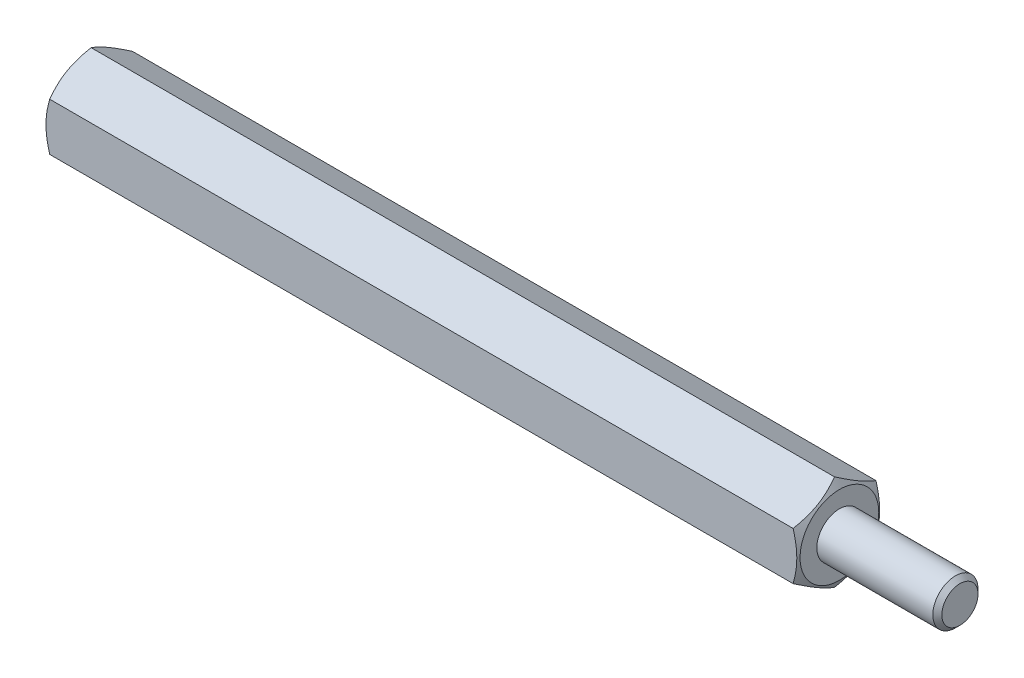
ISO-10303-21;
HEADER;
FILE_DESCRIPTION(('STEP AP214'),'2;1');
FILE_NAME('part.step','',(''),(''),'','','');
FILE_SCHEMA(('AUTOMOTIVE_DESIGN { 1 0 10303 214 1 1 1 1 }'));
ENDSEC;
DATA;
#1=APPLICATION_CONTEXT('core data for automotive mechanical design processes');
#2=APPLICATION_PROTOCOL_DEFINITION('international standard','automotive_design',2000,#1);
#3=PRODUCT_CONTEXT('',#1,'mechanical');
#4=PRODUCT('Part','Part','',(#3));
#5=PRODUCT_RELATED_PRODUCT_CATEGORY('part','',(#4));
#6=PRODUCT_DEFINITION_FORMATION('','',#4);
#7=PRODUCT_DEFINITION_CONTEXT('part definition',#1,'design');
#8=PRODUCT_DEFINITION('design','',#6,#7);
#9=PRODUCT_DEFINITION_SHAPE('','',#8);
#10=(LENGTH_UNIT() NAMED_UNIT(*) SI_UNIT(.MILLI.,.METRE.));
#11=(NAMED_UNIT(*) PLANE_ANGLE_UNIT() SI_UNIT($,.RADIAN.));
#12=(NAMED_UNIT(*) SI_UNIT($,.STERADIAN.) SOLID_ANGLE_UNIT());
#13=UNCERTAINTY_MEASURE_WITH_UNIT(LENGTH_MEASURE(1.E-05),#10,'distance_accuracy_value','');
#14=(GEOMETRIC_REPRESENTATION_CONTEXT(3) GLOBAL_UNCERTAINTY_ASSIGNED_CONTEXT((#13)) GLOBAL_UNIT_ASSIGNED_CONTEXT((#10,
#11,#12)) REPRESENTATION_CONTEXT('',''));
#15=CARTESIAN_POINT('',(0.,0.,0.));
#16=DIRECTION('',(0.,0.,1.));
#17=DIRECTION('',(1.,0.,0.));
#18=AXIS2_PLACEMENT_3D('',#15,#16,#17);
#19=CARTESIAN_POINT('',(50.,0.,0.));
#20=DIRECTION('',(1.,0.,0.));
#21=DIRECTION('',(0.,0.,-1.));
#22=AXIS2_PLACEMENT_3D('',#19,#20,#21);
#23=PLANE('',#22);
#24=CARTESIAN_POINT('',(50.,0.,0.));
#25=DIRECTION('',(1.,0.,0.));
#26=DIRECTION('',(0.,0.,-1.));
#27=AXIS2_PLACEMENT_3D('',#24,#25,#26);
#28=CIRCLE('',#27,1.5);
#29=CARTESIAN_POINT('',(50.,0.,-1.5));
#30=VERTEX_POINT('',#29);
#31=EDGE_CURVE('E122',#30,#30,#28,.T.);
#32=ORIENTED_EDGE('',*,*,#31,.F.);
#33=EDGE_LOOP('',(#32));
#34=FACE_BOUND('',#33,.T.);
#35=CARTESIAN_POINT('',(50.,0.,0.));
#36=DIRECTION('',(1.,0.,0.));
#37=DIRECTION('',(0.,0.,-1.));
#38=AXIS2_PLACEMENT_3D('',#35,#36,#37);
#39=CIRCLE('',#38,2.61250000000001);
#40=CARTESIAN_POINT('',(50.,0.,-2.61250000000001));
#41=VERTEX_POINT('',#40);
#42=EDGE_CURVE('E254',#41,#41,#39,.T.);
#43=ORIENTED_EDGE('',*,*,#42,.T.);
#44=EDGE_LOOP('',(#43));
#45=FACE_BOUND('',#44,.T.);
#46=ADVANCED_FACE('F35',(#34,#45),#23,.T.);
#47=CARTESIAN_POINT('',(58.,0.,0.));
#48=DIRECTION('',(-1.,0.,0.));
#49=DIRECTION('',(0.,0.,1.));
#50=AXIS2_PLACEMENT_3D('',#47,#48,#49);
#51=CYLINDRICAL_SURFACE('',#50,1.5);
#52=CARTESIAN_POINT('',(57.7,0.,0.));
#53=DIRECTION('',(1.,0.,0.));
#54=DIRECTION('',(0.,0.,-1.));
#55=AXIS2_PLACEMENT_3D('',#52,#53,#54);
#56=CIRCLE('',#55,1.5);
#57=CARTESIAN_POINT('',(57.7,0.,-1.5));
#58=VERTEX_POINT('',#57);
#59=EDGE_CURVE('E11',#58,#58,#56,.F.);
#60=ORIENTED_EDGE('',*,*,#59,.T.);
#61=EDGE_LOOP('',(#60));
#62=FACE_BOUND('',#61,.T.);
#63=ORIENTED_EDGE('',*,*,#31,.T.);
#64=EDGE_LOOP('',(#63));
#65=FACE_BOUND('',#64,.T.);
#66=ADVANCED_FACE('F231',(#62,#65),#51,.T.);
#67=CARTESIAN_POINT('',(58.,0.,0.));
#68=DIRECTION('',(1.,0.,0.));
#69=DIRECTION('',(0.,0.,-1.));
#70=AXIS2_PLACEMENT_3D('',#67,#68,#69);
#71=PLANE('',#70);
#72=CARTESIAN_POINT('',(58.,0.,0.));
#73=DIRECTION('',(1.,0.,0.));
#74=DIRECTION('',(0.,0.,-1.));
#75=AXIS2_PLACEMENT_3D('',#72,#73,#74);
#76=CIRCLE('',#75,1.20000000000001);
#77=CARTESIAN_POINT('',(58.,0.,-1.20000000000001));
#78=VERTEX_POINT('',#77);
#79=EDGE_CURVE('E43',#78,#78,#76,.T.);
#80=ORIENTED_EDGE('',*,*,#79,.T.);
#81=EDGE_LOOP('',(#80));
#82=FACE_BOUND('',#81,.T.);
#83=ADVANCED_FACE('F154',(#82),#71,.T.);
#84=CARTESIAN_POINT('',(50.,0.,0.));
#85=DIRECTION('',(-1.,0.,0.));
#86=DIRECTION('',(0.,0.,1.));
#87=AXIS2_PLACEMENT_3D('',#84,#85,#86);
#88=CONICAL_SURFACE('',#87,2.61250000000001,1.0471975511966);
#89=ORIENTED_EDGE('',*,*,#42,.F.);
#90=EDGE_LOOP('',(#89));
#91=FACE_BOUND('',#90,.T.);
#92=CARTESIAN_POINT('',(49.6749275746217,1.58759777021764,-2.7502));
#93=CARTESIAN_POINT('',(49.7152266757372,1.65737010029699,-2.62935077934009));
#94=CARTESIAN_POINT('',(49.7518774353888,1.72774469983534,-2.50745839737736));
#95=CARTESIAN_POINT('',(49.8158521550166,1.86971254687003,-2.2615628732721));
#96=CARTESIAN_POINT('',(49.8431534823119,1.94130831721583,-2.13755536142614));
#97=CARTESIAN_POINT('',(49.8856525926923,2.08361254889599,-1.89107720202405));
#98=CARTESIAN_POINT('',(49.901133219364,2.15429911309864,-1.76864448141258));
#99=CARTESIAN_POINT('',(49.9196149406165,2.29600490065923,-1.52320285763108));
#100=CARTESIAN_POINT('',(49.9226313385238,2.36702360884404,-1.40019484676708));
#101=CARTESIAN_POINT('',(49.9163611925579,2.49972966594897,-1.1703412133892));
#102=CARTESIAN_POINT('',(49.9086141837097,2.56143686540073,-1.06346120874597));
#103=CARTESIAN_POINT('',(49.8840591569221,2.68444923614047,-0.850397532665245));
#104=CARTESIAN_POINT('',(49.8672427483359,2.74575398185008,-0.744214598351105));
#105=CARTESIAN_POINT('',(49.8252024156405,2.86902004703207,-0.530711510606811));
#106=CARTESIAN_POINT('',(49.7998002572992,2.93096576264319,-0.42341838385714));
#107=CARTESIAN_POINT('',(49.7421471121465,3.05393320806134,-0.210432520715945));
#108=CARTESIAN_POINT('',(49.7099096746875,3.11495651365995,-0.104737054973344));
#109=CARTESIAN_POINT('',(49.6749275746217,3.17554195059678,0.000200000000003022));
#110=B_SPLINE_CURVE_WITH_KNOTS('',3,(#92,#93,#94,#95,#96,#97,#98,#99,#100,#101,#102,#103,#104,
#105,#106,#107,#108,#109),.UNSPECIFIED.,.F.,.F.,(4,2,2,2,2,2,2,2,4),(0.,0.435912828725887,
0.872873557116332,1.29901931904671,1.72464171213574,2.09526089052938,2.46622354066374,
2.84541551798557,3.22386274754524),.UNSPECIFIED.);
#111=CARTESIAN_POINT('',(49.6749942449246,1.58771324027148,-2.75));
#112=VERTEX_POINT('',#111);
#113=CARTESIAN_POINT('',(49.6749942449246,3.17542648054294,0.));
#114=VERTEX_POINT('',#113);
#115=EDGE_CURVE('E133',#112,#114,#110,.T.);
#116=ORIENTED_EDGE('',*,*,#115,.T.);
#117=CARTESIAN_POINT('',(49.6749275746217,3.17554195059678,-0.000199999999995645));
#118=CARTESIAN_POINT('',(49.7152266757372,3.10576962051743,0.12064922065991));
#119=CARTESIAN_POINT('',(49.7518774353888,3.03539502097908,0.242541602622638));
#120=CARTESIAN_POINT('',(49.8158521550166,2.89342717394439,0.488437126727897));
#121=CARTESIAN_POINT('',(49.8431534823119,2.82183140359858,0.612444638573861));
#122=CARTESIAN_POINT('',(49.8856525926923,2.67952717191843,0.858922797975949));
#123=CARTESIAN_POINT('',(49.901133219364,2.60884060771577,0.981355518587423));
#124=CARTESIAN_POINT('',(49.9196149406165,2.46713482015519,1.22679714236892));
#125=CARTESIAN_POINT('',(49.9226313385238,2.39611611197038,1.34980515323292));
#126=CARTESIAN_POINT('',(49.9163611925579,2.26341005486544,1.5796587866108));
#127=CARTESIAN_POINT('',(49.9086141837097,2.20170285541369,1.68653879125403));
#128=CARTESIAN_POINT('',(49.8840591569221,2.07869048467395,1.89960246733475));
#129=CARTESIAN_POINT('',(49.8672427483359,2.01738573896434,2.00578540164889));
#130=CARTESIAN_POINT('',(49.8252024156405,1.89411967378235,2.21928848939319));
#131=CARTESIAN_POINT('',(49.7998002572992,1.83217395817123,2.32658161614286));
#132=CARTESIAN_POINT('',(49.7421471121465,1.70920651275308,2.53956747928405));
#133=CARTESIAN_POINT('',(49.7099096746875,1.64818320715446,2.64526294502665));
#134=CARTESIAN_POINT('',(49.6749275746217,1.58759777021764,2.7502));
#135=B_SPLINE_CURVE_WITH_KNOTS('',3,(#117,#118,#119,#120,#121,#122,#123,#124,#125,#126,#127,
#128,#129,#130,#131,#132,#133,#134),.UNSPECIFIED.,.F.,.F.,(4,2,2,2,2,2,2,2,4),(0.,
0.435912828725887,0.872873557116332,1.29901931904672,1.72464171213574,2.09526089052937,
2.46622354066374,2.84541551798557,3.22386274754524),.UNSPECIFIED.);
#136=CARTESIAN_POINT('',(49.6749942449246,1.58771324027147,2.75));
#137=VERTEX_POINT('',#136);
#138=EDGE_CURVE('E141',#114,#137,#135,.T.);
#139=ORIENTED_EDGE('',*,*,#138,.T.);
#140=CARTESIAN_POINT('',(48.5576319326316,-4.30782014241011,2.75));
#141=CARTESIAN_POINT('',(48.6162836095867,-4.18726531654581,2.75));
#142=CARTESIAN_POINT('',(48.6743849240466,-4.06643816910979,2.75));
#143=CARTESIAN_POINT('',(48.7891778669407,-3.8240944166195,2.75));
#144=CARTESIAN_POINT('',(48.8458692806511,-3.70257770996671,2.75));
#145=CARTESIAN_POINT('',(48.9578090560797,-3.458105356063,2.75));
#146=CARTESIAN_POINT('',(49.0130482619427,-3.33514550230564,2.75));
#147=CARTESIAN_POINT('',(49.1213204698911,-3.08826186435015,2.75));
#148=CARTESIAN_POINT('',(49.1743535739049,-2.96433812500113,2.75));
#149=CARTESIAN_POINT('',(49.2792921273943,-2.7113269404381,2.75));
#150=CARTESIAN_POINT('',(49.3311065567683,-2.58220154142924,2.75));
#151=CARTESIAN_POINT('',(49.430916990516,-2.32245648864391,2.75));
#152=CARTESIAN_POINT('',(49.4789125727853,-2.19183667150655,2.75));
#153=CARTESIAN_POINT('',(49.5698579692354,-1.92912498594656,2.75));
#154=CARTESIAN_POINT('',(49.6128175918125,-1.79703654670007,2.75));
#155=CARTESIAN_POINT('',(49.6923417781181,-1.53096629694382,2.75));
#156=CARTESIAN_POINT('',(49.7289083094407,-1.39698508274037,2.75));
#157=CARTESIAN_POINT('',(49.7937438460925,-1.12772708047234,2.75));
#158=CARTESIAN_POINT('',(49.8220547897378,-0.992460577616631,2.75));
#159=CARTESIAN_POINT('',(49.8687813176856,-0.720203153927685,2.75));
#160=CARTESIAN_POINT('',(49.8871980675805,-0.583212438163358,2.75));
#161=CARTESIAN_POINT('',(49.9124291314624,-0.309989978008801,2.75));
#162=CARTESIAN_POINT('',(49.9193954911205,-0.17377262999625,2.75));
#163=CARTESIAN_POINT('',(49.9215379629552,0.0987726794769197,2.75));
#164=CARTESIAN_POINT('',(49.9167134971984,0.235100646032144,2.75));
#165=CARTESIAN_POINT('',(49.8989680753535,0.465158037199999,2.75));
#166=CARTESIAN_POINT('',(49.8889841108657,0.559128814459647,2.75));
#167=CARTESIAN_POINT('',(49.8640111201075,0.746408748148825,2.75));
#168=CARTESIAN_POINT('',(49.8490213815566,0.839717808490765,2.75));
#169=CARTESIAN_POINT('',(49.7973222369876,1.11853931619131,2.75));
#170=CARTESIAN_POINT('',(49.7538938441819,1.30282115121641,2.75));
#171=CARTESIAN_POINT('',(49.6782135831305,1.5786792582721,2.75));
#172=CARTESIAN_POINT('',(49.6508277417716,1.67167174830885,2.75));
#173=CARTESIAN_POINT('',(49.5931453490653,1.85669755112827,2.75));
#174=CARTESIAN_POINT('',(49.562850519184,1.94873139590001,2.75));
#175=CARTESIAN_POINT('',(49.4998214739185,2.13194851920638,2.75));
#176=CARTESIAN_POINT('',(49.4670873446708,2.22313182764733,2.75));
#177=CARTESIAN_POINT('',(49.3995759688816,2.40475072200258,2.75));
#178=CARTESIAN_POINT('',(49.3647984472483,2.49518620536279,2.75));
#179=CARTESIAN_POINT('',(49.286074979109,2.69425906745494,2.75));
#180=CARTESIAN_POINT('',(49.2417347386106,2.8027401541903,2.75));
#181=CARTESIAN_POINT('',(49.1510337491748,3.01885617108242,2.75));
#182=CARTESIAN_POINT('',(49.1046729095401,3.12649106300008,2.75));
#183=CARTESIAN_POINT('',(48.9631220023641,3.44835421203614,2.75));
#184=CARTESIAN_POINT('',(48.865478930226,3.6615028537882,2.75));
#185=CARTESIAN_POINT('',(48.6657085844919,4.0858235012659,2.75));
#186=CARTESIAN_POINT('',(48.5635786539451,4.29699424346804,2.75));
#187=CARTESIAN_POINT('',(48.3561807980291,4.71779425640231,2.75));
#188=CARTESIAN_POINT('',(48.2509127618966,4.92742347239814,2.75));
#189=CARTESIAN_POINT('',(48.037845903081,5.34602646409933,2.75));
#190=CARTESIAN_POINT('',(47.9300415771346,5.55499742988841,2.75));
#191=CARTESIAN_POINT('',(47.7127213552635,5.97205161125948,2.75));
#192=CARTESIAN_POINT('',(47.6032054225523,6.18013480763858,2.75));
#193=CARTESIAN_POINT('',(47.2728160121337,6.80319050465919,2.75));
#194=CARTESIAN_POINT('',(47.0500134395911,7.21713914846338,2.75));
#195=CARTESIAN_POINT('',(46.6349320787507,7.98131294129821,2.75));
#196=CARTESIAN_POINT('',(46.443091202704,8.33177707266852,2.75));
#197=CARTESIAN_POINT('',(46.0577699675954,9.03185646098385,2.75));
#198=CARTESIAN_POINT('',(45.8642894185863,9.38147161337288,2.75));
#199=CARTESIAN_POINT('',(45.4770176449484,10.0785196333477,2.75));
#200=CARTESIAN_POINT('',(45.2832315222264,10.425955339249,2.75));
#201=CARTESIAN_POINT('',(44.8948017372515,11.1202888046247,2.75));
#202=CARTESIAN_POINT('',(44.7001581879707,11.4671866272798,2.75));
#203=CARTESIAN_POINT('',(44.5052089419494,11.8139117951099,2.75));
#204=B_SPLINE_CURVE_WITH_KNOTS('',3,(#140,#141,#142,#143,#144,#145,#146,#147,#148,#149,#150,
#151,#152,#153,#154,#155,#156,#157,#158,#159,#160,#161,#162,#163,#164,#165,#166,#167,#168,#169,
#170,#171,#172,#173,#174,#175,#176,#177,#178,#179,#180,#181,#182,#183,#184,#185,#186,#187,#188,
#189,#190,#191,#192,#193,#194,#195,#196,#197,#198,#199,#200,#201,#202,#203),.UNSPECIFIED.,.F.,
.F.,(4,2,2,2,2,2,2,2,2,2,2,2,2,2,2,2,2,2,2,2,2,2,2,2,2,2,2,2,2,2,2,4),(0.,0.402200406174207,
0.804461695776018,1.20883826557492,1.61319613116903,2.03054962807289,2.44794919196405,
2.86452179433193,3.28096596207104,3.69525619374118,4.10949760895259,4.51819266601271,
4.92690775587315,5.21027047572885,5.49367353296155,6.06085418548303,6.35165161864581,
6.64227801348786,6.93289415059065,7.22354950196185,7.57510236122624,7.92667101670864,
8.62993150186774,9.333614197965,10.0373217608381,10.7427306430188,11.4481547069671,
12.8584292219797,14.0570297519007,15.255771084781,16.4492444189717,17.6425649463424),.UNSPECIFIED.);
#205=CARTESIAN_POINT('',(49.6749942449246,-1.58771324027147,2.75));
#206=VERTEX_POINT('',#205);
#207=EDGE_CURVE('E181',#137,#206,#204,.F.);
#208=ORIENTED_EDGE('',*,*,#207,.T.);
#209=CARTESIAN_POINT('',(49.6749275746217,-1.58759777021763,2.7502));
#210=CARTESIAN_POINT('',(49.7152266757372,-1.65737010029699,2.62935077934009));
#211=CARTESIAN_POINT('',(49.7518774353888,-1.72774469983533,2.50745839737736));
#212=CARTESIAN_POINT('',(49.8158521550166,-1.86971254687003,2.26156287327211));
#213=CARTESIAN_POINT('',(49.8431534823119,-1.94130831721583,2.13755536142614));
#214=CARTESIAN_POINT('',(49.8856525926923,-2.08361254889599,1.89107720202406));
#215=CARTESIAN_POINT('',(49.901133219364,-2.15429911309864,1.76864448141258));
#216=CARTESIAN_POINT('',(49.9196149406165,-2.29600490065923,1.52320285763108));
#217=CARTESIAN_POINT('',(49.9226313385238,-2.36702360884404,1.40019484676709));
#218=CARTESIAN_POINT('',(49.9163611925579,-2.49972966594897,1.1703412133892));
#219=CARTESIAN_POINT('',(49.9086141837097,-2.56143686540073,1.06346120874598));
#220=CARTESIAN_POINT('',(49.8840591569221,-2.68444923614047,0.850397532665247));
#221=CARTESIAN_POINT('',(49.8672427483359,-2.74575398185008,0.744214598351108));
#222=CARTESIAN_POINT('',(49.8252024156405,-2.86902004703207,0.530711510606812));
#223=CARTESIAN_POINT('',(49.7998002572992,-2.93096576264319,0.423418383857141));
#224=CARTESIAN_POINT('',(49.7421471121465,-3.05393320806134,0.210432520715944));
#225=CARTESIAN_POINT('',(49.7099096746875,-3.11495651365995,0.104737054973342));
#226=CARTESIAN_POINT('',(49.6749275746217,-3.17554195059678,-0.000200000000004793));
#227=B_SPLINE_CURVE_WITH_KNOTS('',3,(#209,#210,#211,#212,#213,#214,#215,#216,#217,#218,#219,
#220,#221,#222,#223,#224,#225,#226),.UNSPECIFIED.,.F.,.F.,(4,2,2,2,2,2,2,2,4),(0.,
0.435912828725886,0.872873557116331,1.29901931904671,1.72464171213574,2.09526089052938,
2.46622354066375,2.84541551798557,3.22386274754525),.UNSPECIFIED.);
#228=CARTESIAN_POINT('',(49.6749942449246,-3.17542648054294,0.));
#229=VERTEX_POINT('',#228);
#230=EDGE_CURVE('E176',#206,#229,#227,.T.);
#231=ORIENTED_EDGE('',*,*,#230,.T.);
#232=CARTESIAN_POINT('',(49.6749275746217,-3.17554195059678,0.000199999999994542));
#233=CARTESIAN_POINT('',(49.7152266757372,-3.10576962051743,-0.120649220659911));
#234=CARTESIAN_POINT('',(49.7518774353888,-3.03539502097908,-0.242541602622639));
#235=CARTESIAN_POINT('',(49.8158521550166,-2.89342717394439,-0.488437126727897));
#236=CARTESIAN_POINT('',(49.8431534823119,-2.82183140359859,-0.61244463857386));
#237=CARTESIAN_POINT('',(49.8856525926923,-2.67952717191843,-0.858922797975949));
#238=CARTESIAN_POINT('',(49.901133219364,-2.60884060771577,-0.981355518587423));
#239=CARTESIAN_POINT('',(49.9196149406165,-2.46713482015519,-1.22679714236892));
#240=CARTESIAN_POINT('',(49.9226313385238,-2.39611611197038,-1.34980515323292));
#241=CARTESIAN_POINT('',(49.9163611925579,-2.26341005486544,-1.5796587866108));
#242=CARTESIAN_POINT('',(49.9086141837097,-2.20170285541369,-1.68653879125403));
#243=CARTESIAN_POINT('',(49.8840591569221,-2.07869048467395,-1.89960246733475));
#244=CARTESIAN_POINT('',(49.8672427483359,-2.01738573896434,-2.00578540164889));
#245=CARTESIAN_POINT('',(49.8252024156405,-1.89411967378235,-2.21928848939318));
#246=CARTESIAN_POINT('',(49.7998002572992,-1.83217395817123,-2.32658161614286));
#247=CARTESIAN_POINT('',(49.7421471121465,-1.70920651275308,-2.53956747928405));
#248=CARTESIAN_POINT('',(49.7099096746875,-1.64818320715447,-2.64526294502665));
#249=CARTESIAN_POINT('',(49.6749275746217,-1.58759777021764,-2.7502));
#250=B_SPLINE_CURVE_WITH_KNOTS('',3,(#232,#233,#234,#235,#236,#237,#238,#239,#240,#241,#242,
#243,#244,#245,#246,#247,#248,#249),.UNSPECIFIED.,.F.,.F.,(4,2,2,2,2,2,2,2,4),(0.,
0.435912828725886,0.87287355711633,1.29901931904671,1.72464171213574,2.09526089052937,
2.46622354066374,2.84541551798556,3.22386274754523),.UNSPECIFIED.);
#251=CARTESIAN_POINT('',(49.6749942449246,-1.58771324027148,-2.75));
#252=VERTEX_POINT('',#251);
#253=EDGE_CURVE('E50',#229,#252,#250,.T.);
#254=ORIENTED_EDGE('',*,*,#253,.T.);
#255=CARTESIAN_POINT('',(48.5576319321002,-4.30782014350211,-2.75));
#256=CARTESIAN_POINT('',(48.6162836090775,-4.18726531760098,-2.75));
#257=CARTESIAN_POINT('',(48.6743849235596,-4.06643817012811,-2.75));
#258=CARTESIAN_POINT('',(48.789177866498,-3.824094417564,-2.75));
#259=CARTESIAN_POINT('',(48.8458692802305,-3.70257771087424,-2.75));
#260=CARTESIAN_POINT('',(48.9578090557033,-3.45810535689603,-2.75));
#261=CARTESIAN_POINT('',(49.0130482615885,-3.33514550310114,-2.75));
#262=CARTESIAN_POINT('',(49.1213204695807,-3.08826186507032,-2.75));
#263=CARTESIAN_POINT('',(49.1743535736162,-2.9643381256835,-2.75));
#264=CARTESIAN_POINT('',(49.2792921271496,-2.71132694104215,-2.75));
#265=CARTESIAN_POINT('',(49.3311065565458,-2.58220154199273,-2.75));
#266=CARTESIAN_POINT('',(49.4309169903368,-2.32245648912563,-2.75));
#267=CARTESIAN_POINT('',(49.4789125726271,-2.19183667194707,-2.75));
#268=CARTESIAN_POINT('',(49.5698579691173,-1.9291249863039,-2.75));
#269=CARTESIAN_POINT('',(49.6128175917135,-1.79703654701544,-2.75));
#270=CARTESIAN_POINT('',(49.692341778054,-1.53096629717411,-2.75));
#271=CARTESIAN_POINT('',(49.7289083093926,-1.39698508292755,-2.75));
#272=CARTESIAN_POINT('',(49.7937438460766,-1.12772708055107,-2.75));
#273=CARTESIAN_POINT('',(49.8220547897369,-0.992460577629729,-2.75));
#274=CARTESIAN_POINT('',(49.8687813177048,-0.720203153807918,-2.75));
#275=CARTESIAN_POINT('',(49.8871980676048,-0.583212437976368,-2.75));
#276=CARTESIAN_POINT('',(49.912429131485,-0.309989977688433,-2.75));
#277=CARTESIAN_POINT('',(49.9193954911365,-0.173772629609738,-2.75));
#278=CARTESIAN_POINT('',(49.9215379629464,0.098772679994709,-2.75));
#279=CARTESIAN_POINT('',(49.9167134971714,0.235100646615068,-2.75));
#280=CARTESIAN_POINT('',(49.8989680752898,0.465158037864659,-2.75));
#281=CARTESIAN_POINT('',(49.8889841107875,0.559128815141645,-2.75));
#282=CARTESIAN_POINT('',(49.8640111199994,0.746408748864726,-2.75));
#283=CARTESIAN_POINT('',(49.8490213814332,0.83971780922323,-2.75));
#284=CARTESIAN_POINT('',(49.797322236818,1.11853931697259,-2.75));
#285=CARTESIAN_POINT('',(49.7538938439809,1.30282115202896,-2.75));
#286=CARTESIAN_POINT('',(49.6782135828835,1.57867925913149,-2.75));
#287=CARTESIAN_POINT('',(49.6508277415091,1.67167174918423,-2.75));
#288=CARTESIAN_POINT('',(49.5931453487722,1.85669755203541,-2.75));
#289=CARTESIAN_POINT('',(49.5628505188759,1.94873139682294,-2.75));
#290=CARTESIAN_POINT('',(49.4998214735808,2.13194852016076,-2.75));
#291=CARTESIAN_POINT('',(49.4670873443186,2.22313182861738,-2.75));
#292=CARTESIAN_POINT('',(49.399575968501,2.40475072300398,-2.75));
#293=CARTESIAN_POINT('',(49.3647984468537,2.49518620637986,-2.75));
#294=CARTESIAN_POINT('',(49.2860749786937,2.69425906848207,-2.75));
#295=CARTESIAN_POINT('',(49.2417347381892,2.80274015521204,-2.74999999999999));
#296=CARTESIAN_POINT('',(49.1510337487429,3.01885617209384,-2.74999999999999));
#297=CARTESIAN_POINT('',(49.1046729091036,3.12649106400655,-2.74999999999999));
#298=CARTESIAN_POINT('',(48.9631220019155,3.44835421302832,-2.74999999999999));
#299=CARTESIAN_POINT('',(48.8654789297715,3.66150285477161,-2.74999999999999));
#300=CARTESIAN_POINT('',(48.6657085840283,4.08582350223269,-2.74999999999999));
#301=CARTESIAN_POINT('',(48.5635786534785,4.29699424442699,-2.74999999999999));
#302=CARTESIAN_POINT('',(48.3561807975579,4.71779425734633,-2.74999999999999));
#303=CARTESIAN_POINT('',(48.2509127614241,4.92742347333506,-2.74999999999999));
#304=CARTESIAN_POINT('',(48.0378459026071,5.34602646502204,-2.74999999999999));
#305=CARTESIAN_POINT('',(47.9300415766607,5.55499743080399,-2.74999999999999));
#306=CARTESIAN_POINT('',(47.7127213547904,5.9720516121612,-2.74999999999999));
#307=CARTESIAN_POINT('',(47.6032054220802,6.18013480853355,-2.74999999999999));
#308=CARTESIAN_POINT('',(47.2728160116647,6.80319050553457,-2.74999999999999));
#309=CARTESIAN_POINT('',(47.0500134391252,7.21713914932634,-2.74999999999999));
#310=CARTESIAN_POINT('',(46.6349320782842,7.98131294215254,-2.74999999999999));
#311=CARTESIAN_POINT('',(46.4430912022335,8.33177707352653,-2.74999999999999));
#312=CARTESIAN_POINT('',(46.0577699671173,9.03185646184938,-2.74999999999999));
#313=CARTESIAN_POINT('',(45.8642894181045,9.38147161424224,-2.74999999999999));
#314=CARTESIAN_POINT('',(45.4770176444589,10.0785196342265,-2.74999999999999));
#315=CARTESIAN_POINT('',(45.2832315217327,10.4259553401334,-2.74999999999999));
#316=CARTESIAN_POINT('',(44.8948017367494,11.1202888055205,-2.74999999999999));
#317=CARTESIAN_POINT('',(44.7001581874645,11.4671866281813,-2.74999999999999));
#318=CARTESIAN_POINT('',(44.5052089414391,11.8139117960172,-2.74999999999999));
#319=B_SPLINE_CURVE_WITH_KNOTS('',3,(#255,#256,#257,#258,#259,#260,#261,#262,#263,#264,#265,
#266,#267,#268,#269,#270,#271,#272,#273,#274,#275,#276,#277,#278,#279,#280,#281,#282,#283,#284,
#285,#286,#287,#288,#289,#290,#291,#292,#293,#294,#295,#296,#297,#298,#299,#300,#301,#302,#303,
#304,#305,#306,#307,#308,#309,#310,#311,#312,#313,#314,#315,#316,#317,#318),.UNSPECIFIED.,.F.,
.F.,(4,2,2,2,2,2,2,2,2,2,2,2,2,2,2,2,2,2,2,2,2,2,2,2,2,2,2,2,2,2,2,4),(0.,0.402200406302724,
0.80446169603307,1.20883826596186,1.61319613168587,2.03054962872746,2.4479491927564,
2.8645217952616,3.28096596313794,3.69525619500961,4.10949761042227,4.51819266767878,
4.92690775773571,5.21027047764773,5.49367353493676,6.06085418757122,6.35165162079317,
6.64227801569431,6.93289415285606,7.22354950428624,7.57510236354253,7.92667101901679,
8.62993150415944,9.33361420023961,10.0373217630956,10.7427306452573,11.4481547091865,
12.8584292241618,14.0570297540983,15.2557710869939,16.4492444212054,17.6425649485972),.UNSPECIFIED.);
#320=EDGE_CURVE('E106',#252,#112,#319,.T.);
#321=ORIENTED_EDGE('',*,*,#320,.T.);
#322=EDGE_LOOP('',(#116,#139,#208,#231,#254,#321));
#323=FACE_BOUND('',#322,.T.);
#324=ADVANCED_FACE('F149',(#91,#323),#88,.T.);
#325=CARTESIAN_POINT('',(50.,-1.58771324027148,-2.75));
#326=DIRECTION('',(0.,0.,1.));
#327=DIRECTION('',(0.,-1.,0.));
#328=AXIS2_PLACEMENT_3D('',#325,#326,#327);
#329=PLANE('',#328);
#330=DIRECTION('',(-1.,0.,0.));
#331=VECTOR('',#330,1.);
#332=CARTESIAN_POINT('',(50.,-1.58771324027148,-2.75));
#333=LINE('',#332,#331);
#334=CARTESIAN_POINT('',(0.325005755075304,-1.58771324027167,-2.75));
#335=VERTEX_POINT('',#334);
#336=EDGE_CURVE('E100',#252,#335,#333,.T.);
#337=ORIENTED_EDGE('',*,*,#336,.T.);
#338=CARTESIAN_POINT('',(1.44236806789984,-4.30782014350212,-2.75));
#339=CARTESIAN_POINT('',(1.38371639092254,-4.18726531760099,-2.75));
#340=CARTESIAN_POINT('',(1.32561507644045,-4.06643817012812,-2.75));
#341=CARTESIAN_POINT('',(1.21082213350203,-3.824094417564,-2.75));
#342=CARTESIAN_POINT('',(1.15413071976949,-3.70257771087424,-2.75));
#343=CARTESIAN_POINT('',(1.04219094429671,-3.45810535689603,-2.75));
#344=CARTESIAN_POINT('',(0.98695173841154,-3.33514550310114,-2.75));
#345=CARTESIAN_POINT('',(0.878679530419349,-3.08826186507032,-2.75));
#346=CARTESIAN_POINT('',(0.825646426383825,-2.9643381256835,-2.75));
#347=CARTESIAN_POINT('',(0.720707872850375,-2.71132694104215,-2.75));
#348=CARTESIAN_POINT('',(0.668893443454169,-2.58220154199273,-2.75));
#349=CARTESIAN_POINT('',(0.56908300966316,-2.32245648912563,-2.75));
#350=CARTESIAN_POINT('',(0.521087427372889,-2.19183667194707,-2.75));
#351=CARTESIAN_POINT('',(0.430142030882725,-1.9291249863039,-2.75));
#352=CARTESIAN_POINT('',(0.387182408286516,-1.79703654701544,-2.75));
#353=CARTESIAN_POINT('',(0.307658221946016,-1.53096629717411,-2.75));
#354=CARTESIAN_POINT('',(0.271091690607389,-1.39698508292755,-2.75));
#355=CARTESIAN_POINT('',(0.206256153923405,-1.12772708055107,-2.75));
#356=CARTESIAN_POINT('',(0.17794521026309,-0.992460577629727,-2.75));
#357=CARTESIAN_POINT('',(0.131218682295206,-0.720203153807916,-2.75));
#358=CARTESIAN_POINT('',(0.11280193239521,-0.583212437976367,-2.75));
#359=CARTESIAN_POINT('',(0.087570868514987,-0.309989977688431,-2.75));
#360=CARTESIAN_POINT('',(0.0806045088634958,-0.173772629609737,-2.75));
#361=CARTESIAN_POINT('',(0.078462037053641,0.0987726799947109,-2.75));
#362=CARTESIAN_POINT('',(0.0832865028286562,0.23510064661507,-2.75));
#363=CARTESIAN_POINT('',(0.101031924710265,0.465158037864661,-2.75));
#364=CARTESIAN_POINT('',(0.111015889212559,0.559128815141647,-2.75));
#365=CARTESIAN_POINT('',(0.135988880000603,0.746408748864728,-2.75));
#366=CARTESIAN_POINT('',(0.150978618566838,0.839717809223232,-2.75));
#367=CARTESIAN_POINT('',(0.20267776318206,1.1185393169726,-2.75));
#368=CARTESIAN_POINT('',(0.246106156019073,1.30282115202896,-2.75));
#369=CARTESIAN_POINT('',(0.321786417116547,1.57867925913149,-2.75));
#370=CARTESIAN_POINT('',(0.349172258490935,1.67167174918423,-2.75));
#371=CARTESIAN_POINT('',(0.406854651227838,1.85669755203541,-2.75));
#372=CARTESIAN_POINT('',(0.437149481124149,1.94873139682294,-2.75));
#373=CARTESIAN_POINT('',(0.500178526419205,2.13194852016076,-2.75));
#374=CARTESIAN_POINT('',(0.532912655681421,2.22313182861738,-2.75));
#375=CARTESIAN_POINT('',(0.600424031499047,2.40475072300398,-2.75));
#376=CARTESIAN_POINT('',(0.635201553146344,2.49518620637986,-2.75));
#377=CARTESIAN_POINT('',(0.713925021306319,2.69425906848207,-2.75));
#378=CARTESIAN_POINT('',(0.75826526181078,2.80274015521204,-2.74999999999999));
#379=CARTESIAN_POINT('',(0.848966251257138,3.01885617209384,-2.74999999999999));
#380=CARTESIAN_POINT('',(0.895327090896407,3.12649106400656,-2.74999999999999));
#381=CARTESIAN_POINT('',(1.03687799808455,3.44835421302832,-2.74999999999999));
#382=CARTESIAN_POINT('',(1.13452107022851,3.66150285477161,-2.74999999999999));
#383=CARTESIAN_POINT('',(1.33429141597171,4.08582350223269,-2.74999999999999));
#384=CARTESIAN_POINT('',(1.43642134652157,4.29699424442699,-2.74999999999999));
#385=CARTESIAN_POINT('',(1.64381920244215,4.71779425734633,-2.74999999999999));
#386=CARTESIAN_POINT('',(1.74908723857596,4.92742347333506,-2.74999999999999));
#387=CARTESIAN_POINT('',(1.96215409739296,5.34602646502203,-2.74999999999999));
#388=CARTESIAN_POINT('',(2.06995842333932,5.55499743080399,-2.74999999999999));
#389=CARTESIAN_POINT('',(2.28727864520958,5.97205161216119,-2.74999999999999));
#390=CARTESIAN_POINT('',(2.39679457791986,6.18013480853355,-2.74999999999999));
#391=CARTESIAN_POINT('',(2.7271839883353,6.80319050553457,-2.74999999999999));
#392=CARTESIAN_POINT('',(2.94998656087477,7.21713914932633,-2.74999999999999));
#393=CARTESIAN_POINT('',(3.36506792171577,7.98131294215254,-2.74999999999999));
#394=CARTESIAN_POINT('',(3.55690879776654,8.33177707352653,-2.74999999999999));
#395=CARTESIAN_POINT('',(3.94223003288275,9.03185646184938,-2.74999999999999));
#396=CARTESIAN_POINT('',(4.13571058189547,9.38147161424225,-2.74999999999999));
#397=CARTESIAN_POINT('',(4.52298235554117,10.0785196342265,-2.74999999999999));
#398=CARTESIAN_POINT('',(4.71676847826737,10.4259553401334,-2.74999999999999));
#399=CARTESIAN_POINT('',(5.1051982632506,11.1202888055205,-2.74999999999999));
#400=CARTESIAN_POINT('',(5.29984181253548,11.4671866281813,-2.74999999999999));
#401=CARTESIAN_POINT('',(5.49479105856088,11.8139117960173,-2.74999999999999));
#402=B_SPLINE_CURVE_WITH_KNOTS('',3,(#338,#339,#340,#341,#342,#343,#344,#345,#346,#347,#348,
#349,#350,#351,#352,#353,#354,#355,#356,#357,#358,#359,#360,#361,#362,#363,#364,#365,#366,#367,
#368,#369,#370,#371,#372,#373,#374,#375,#376,#377,#378,#379,#380,#381,#382,#383,#384,#385,#386,
#387,#388,#389,#390,#391,#392,#393,#394,#395,#396,#397,#398,#399,#400,#401),.UNSPECIFIED.,.F.,
.F.,(4,2,2,2,2,2,2,2,2,2,2,2,2,2,2,2,2,2,2,2,2,2,2,2,2,2,2,2,2,2,2,4),(0.,0.402200406302722,
0.804461696033069,1.20883826596187,1.61319613168587,2.03054962872746,2.44794919275641,
2.86452179526161,3.28096596313794,3.69525619500962,4.10949761042228,4.51819266767879,
4.92690775773572,5.21027047764774,5.49367353493677,6.06085418757123,6.35165162079318,
6.64227801569432,6.93289415285606,7.22354950428625,7.57510236354254,7.9266710190168,
8.62993150415945,9.33361420023962,10.0373217630956,10.7427306452573,11.4481547091865,
12.8584292241618,14.0570297540983,15.2557710869939,16.4492444212055,17.6425649485972),.UNSPECIFIED.);
#403=CARTESIAN_POINT('',(0.325005755075435,1.58771324027148,-2.75));
#404=VERTEX_POINT('',#403);
#405=EDGE_CURVE('E85',#335,#404,#402,.T.);
#406=ORIENTED_EDGE('',*,*,#405,.T.);
#407=DIRECTION('',(-1.,0.,0.));
#408=VECTOR('',#407,1.);
#409=CARTESIAN_POINT('',(50.,1.58771324027148,-2.75));
#410=LINE('',#409,#408);
#411=EDGE_CURVE('E107',#112,#404,#410,.T.);
#412=ORIENTED_EDGE('',*,*,#411,.F.);
#413=ORIENTED_EDGE('',*,*,#320,.F.);
#414=EDGE_LOOP('',(#337,#406,#412,#413));
#415=FACE_BOUND('',#414,.T.);
#416=ADVANCED_FACE('F105',(#415),#329,.F.);
#417=CARTESIAN_POINT('',(50.,-3.17542648054294,0.));
#418=DIRECTION('',(0.,0.866025403784438,0.5));
#419=DIRECTION('',(0.,-0.5,0.866025403784438));
#420=AXIS2_PLACEMENT_3D('',#417,#418,#419);
#421=PLANE('',#420);
#422=DIRECTION('',(-1.,0.,0.));
#423=VECTOR('',#422,1.);
#424=CARTESIAN_POINT('',(50.,-3.17542648054294,0.));
#425=LINE('',#424,#423);
#426=CARTESIAN_POINT('',(0.325005755075438,-3.17542648054294,0.));
#427=VERTEX_POINT('',#426);
#428=EDGE_CURVE('E102',#229,#427,#425,.T.);
#429=ORIENTED_EDGE('',*,*,#428,.T.);
#430=CARTESIAN_POINT('',(0.325072425378336,-3.17554195059678,0.000199999999995148));
#431=CARTESIAN_POINT('',(0.284773324262838,-3.10576962051743,-0.120649220659911));
#432=CARTESIAN_POINT('',(0.248122564611237,-3.03539502097908,-0.242541602622639));
#433=CARTESIAN_POINT('',(0.184147844983376,-2.89342717394439,-0.488437126727898));
#434=CARTESIAN_POINT('',(0.156846517688073,-2.82183140359859,-0.612444638573861));
#435=CARTESIAN_POINT('',(0.114347407307692,-2.67952717191843,-0.85892279797595));
#436=CARTESIAN_POINT('',(0.0988667806360331,-2.60884060771577,-0.981355518587423));
#437=CARTESIAN_POINT('',(0.0803850593835159,-2.46713482015519,-1.22679714236892));
#438=CARTESIAN_POINT('',(0.0773686614761752,-2.39611611197038,-1.34980515323292));
#439=CARTESIAN_POINT('',(0.0836388074421224,-2.26341005486544,-1.5796587866108));
#440=CARTESIAN_POINT('',(0.0913858162902782,-2.20170285541369,-1.68653879125403));
#441=CARTESIAN_POINT('',(0.115940843077931,-2.07869048467395,-1.89960246733475));
#442=CARTESIAN_POINT('',(0.132757251664146,-2.01738573896434,-2.00578540164889));
#443=CARTESIAN_POINT('',(0.174797584359532,-1.89411967378235,-2.21928848939318));
#444=CARTESIAN_POINT('',(0.200199742700806,-1.83217395817123,-2.32658161614285));
#445=CARTESIAN_POINT('',(0.257852887853556,-1.70920651275308,-2.53956747928405));
#446=CARTESIAN_POINT('',(0.290090325312557,-1.64818320715447,-2.64526294502665));
#447=CARTESIAN_POINT('',(0.325072425378334,-1.58759777021764,-2.7502));
#448=B_SPLINE_CURVE_WITH_KNOTS('',3,(#430,#431,#432,#433,#434,#435,#436,#437,#438,#439,#440,
#441,#442,#443,#444,#445,#446,#447),.UNSPECIFIED.,.F.,.F.,(4,2,2,2,2,2,2,2,4),(0.,
0.435912828725889,0.872873557116333,1.29901931904672,1.72464171213574,2.09526089052938,
2.46622354066374,2.84541551798557,3.22386274754524),.UNSPECIFIED.);
#449=EDGE_CURVE('E88',#427,#335,#448,.T.);
#450=ORIENTED_EDGE('',*,*,#449,.T.);
#451=ORIENTED_EDGE('',*,*,#336,.F.);
#452=ORIENTED_EDGE('',*,*,#253,.F.);
#453=EDGE_LOOP('',(#429,#450,#451,#452));
#454=FACE_BOUND('',#453,.T.);
#455=ADVANCED_FACE('F99',(#454),#421,.F.);
#456=CARTESIAN_POINT('',(50.,-1.58771324027147,2.75));
#457=DIRECTION('',(0.,0.866025403784439,-0.5));
#458=DIRECTION('',(0.,0.5,0.866025403784439));
#459=AXIS2_PLACEMENT_3D('',#456,#457,#458);
#460=PLANE('',#459);
#461=DIRECTION('',(-1.,0.,0.));
#462=VECTOR('',#461,1.);
#463=CARTESIAN_POINT('',(50.,-1.58771324027147,2.75));
#464=LINE('',#463,#462);
#465=CARTESIAN_POINT('',(0.325005755075436,-1.58771324027147,2.75));
#466=VERTEX_POINT('',#465);
#467=EDGE_CURVE('E109',#206,#466,#464,.T.);
#468=ORIENTED_EDGE('',*,*,#467,.T.);
#469=CARTESIAN_POINT('',(0.325072425378334,-1.58759777021763,2.7502));
#470=CARTESIAN_POINT('',(0.284773324262837,-1.65737010029699,2.62935077934009));
#471=CARTESIAN_POINT('',(0.248122564611235,-1.72774469983533,2.50745839737736));
#472=CARTESIAN_POINT('',(0.184147844983374,-1.86971254687003,2.26156287327211));
#473=CARTESIAN_POINT('',(0.156846517688071,-1.94130831721583,2.13755536142614));
#474=CARTESIAN_POINT('',(0.11434740730769,-2.08361254889599,1.89107720202405));
#475=CARTESIAN_POINT('',(0.0988667806360311,-2.15429911309864,1.76864448141258));
#476=CARTESIAN_POINT('',(0.0803850593835137,-2.29600490065923,1.52320285763108));
#477=CARTESIAN_POINT('',(0.077368661476173,-2.36702360884404,1.40019484676709));
#478=CARTESIAN_POINT('',(0.0836388074421202,-2.49972966594897,1.1703412133892));
#479=CARTESIAN_POINT('',(0.0913858162902759,-2.56143686540073,1.06346120874598));
#480=CARTESIAN_POINT('',(0.115940843077929,-2.68444923614047,0.850397532665247));
#481=CARTESIAN_POINT('',(0.132757251664144,-2.74575398185008,0.744214598351108));
#482=CARTESIAN_POINT('',(0.174797584359531,-2.86902004703207,0.530711510606812));
#483=CARTESIAN_POINT('',(0.200199742700805,-2.93096576264319,0.423418383857141));
#484=CARTESIAN_POINT('',(0.257852887853557,-3.05393320806134,0.210432520715944));
#485=CARTESIAN_POINT('',(0.290090325312558,-3.11495651365995,0.104737054973343));
#486=CARTESIAN_POINT('',(0.325072425378336,-3.17554195059678,-0.000200000000004913));
#487=B_SPLINE_CURVE_WITH_KNOTS('',3,(#469,#470,#471,#472,#473,#474,#475,#476,#477,#478,#479,
#480,#481,#482,#483,#484,#485,#486),.UNSPECIFIED.,.F.,.F.,(4,2,2,2,2,2,2,2,4),(0.,
0.435912828725889,0.872873557116333,1.29901931904672,1.72464171213574,2.09526089052938,
2.46622354066375,2.84541551798558,3.22386274754525),.UNSPECIFIED.);
#488=EDGE_CURVE('E103',#466,#427,#487,.T.);
#489=ORIENTED_EDGE('',*,*,#488,.T.);
#490=ORIENTED_EDGE('',*,*,#428,.F.);
#491=ORIENTED_EDGE('',*,*,#230,.F.);
#492=EDGE_LOOP('',(#468,#489,#490,#491));
#493=FACE_BOUND('',#492,.T.);
#494=ADVANCED_FACE('F190',(#493),#460,.F.);
#495=CARTESIAN_POINT('',(50.,1.58771324027147,2.75));
#496=DIRECTION('',(0.,0.,-1.));
#497=DIRECTION('',(-1.,0.,0.));
#498=AXIS2_PLACEMENT_3D('',#495,#496,#497);
#499=PLANE('',#498);
#500=DIRECTION('',(-1.,0.,0.));
#501=VECTOR('',#500,1.);
#502=CARTESIAN_POINT('',(50.,1.58771324027147,2.75));
#503=LINE('',#502,#501);
#504=CARTESIAN_POINT('',(0.325005755075436,1.58771324027147,2.75));
#505=VERTEX_POINT('',#504);
#506=EDGE_CURVE('E117',#137,#505,#503,.T.);
#507=ORIENTED_EDGE('',*,*,#506,.T.);
#508=CARTESIAN_POINT('',(1.44236806736841,-4.30782014241011,2.75));
#509=CARTESIAN_POINT('',(1.38371639041334,-4.18726531654581,2.75));
#510=CARTESIAN_POINT('',(1.32561507595345,-4.06643816910979,2.75));
#511=CARTESIAN_POINT('',(1.21082213305934,-3.8240944166195,2.75));
#512=CARTESIAN_POINT('',(1.1541307193489,-3.7025777099667,2.75));
#513=CARTESIAN_POINT('',(1.04219094392033,-3.458105356063,2.75));
#514=CARTESIAN_POINT('',(0.986951738057271,-3.33514550230565,2.75));
#515=CARTESIAN_POINT('',(0.878679530108924,-3.08826186435015,2.75));
#516=CARTESIAN_POINT('',(0.825646426095137,-2.96433812500113,2.75));
#517=CARTESIAN_POINT('',(0.720707872605697,-2.7113269404381,2.75));
#518=CARTESIAN_POINT('',(0.668893443231718,-2.58220154142924,2.75));
#519=CARTESIAN_POINT('',(0.569083009483976,-2.32245648864391,2.75));
#520=CARTESIAN_POINT('',(0.521087427214747,-2.19183667150655,2.75));
#521=CARTESIAN_POINT('',(0.430142030764656,-1.92912498594656,2.75));
#522=CARTESIAN_POINT('',(0.387182408187483,-1.79703654670007,2.75));
#523=CARTESIAN_POINT('',(0.307658221881957,-1.53096629694382,2.75));
#524=CARTESIAN_POINT('',(0.271091690559267,-1.39698508274037,2.75));
#525=CARTESIAN_POINT('',(0.206256153907478,-1.12772708047234,2.75));
#526=CARTESIAN_POINT('',(0.17794521026218,-0.992460577616632,2.75));
#527=CARTESIAN_POINT('',(0.131218682314428,-0.720203153927684,2.75));
#528=CARTESIAN_POINT('',(0.112801932419557,-0.583212438163357,2.75));
#529=CARTESIAN_POINT('',(0.0875708685376005,-0.3099899780088,2.75));
#530=CARTESIAN_POINT('',(0.0806045088794706,-0.17377262999625,2.75));
#531=CARTESIAN_POINT('',(0.0784620370447877,0.0987726794769202,2.75));
#532=CARTESIAN_POINT('',(0.0832865028016105,0.235100646032145,2.75));
#533=CARTESIAN_POINT('',(0.101031924646524,0.465158037200001,2.75));
#534=CARTESIAN_POINT('',(0.111015889134282,0.559128814459649,2.75));
#535=CARTESIAN_POINT('',(0.135988879892486,0.746408748148828,2.75));
#536=CARTESIAN_POINT('',(0.150978618443414,0.839717808490768,2.75));
#537=CARTESIAN_POINT('',(0.202677763012389,1.11853931619132,2.75));
#538=CARTESIAN_POINT('',(0.246106155818158,1.30282115121641,2.75));
#539=CARTESIAN_POINT('',(0.321786416869488,1.5786792582721,2.75));
#540=CARTESIAN_POINT('',(0.349172258228362,1.67167174830886,2.75));
#541=CARTESIAN_POINT('',(0.406854650934721,1.85669755112827,2.75));
#542=CARTESIAN_POINT('',(0.437149480816003,1.94873139590001,2.75));
#543=CARTESIAN_POINT('',(0.500178526081535,2.13194851920638,2.75));
#544=CARTESIAN_POINT('',(0.532912655329257,2.22313182764733,2.75));
#545=CARTESIAN_POINT('',(0.600424031118393,2.40475072200258,2.75));
#546=CARTESIAN_POINT('',(0.635201552751694,2.49518620536279,2.75));
#547=CARTESIAN_POINT('',(0.713925020890995,2.69425906745494,2.75));
#548=CARTESIAN_POINT('',(0.758265261389449,2.8027401541903,2.75));
#549=CARTESIAN_POINT('',(0.848966250825205,3.01885617108242,2.75));
#550=CARTESIAN_POINT('',(0.895327090459879,3.12649106300008,2.75));
#551=CARTESIAN_POINT('',(1.03687799763589,3.44835421203613,2.75));
#552=CARTESIAN_POINT('',(1.13452106977397,3.66150285378819,2.75));
#553=CARTESIAN_POINT('',(1.33429141550814,4.0858235012659,2.75));
#554=CARTESIAN_POINT('',(1.43642134605488,4.29699424346804,2.75));
#555=CARTESIAN_POINT('',(1.64381920197094,4.71779425640232,2.75));
#556=CARTESIAN_POINT('',(1.74908723810337,4.92742347239814,2.75));
#557=CARTESIAN_POINT('',(1.96215409691901,5.34602646409933,2.75));
#558=CARTESIAN_POINT('',(2.06995842286541,5.55499742988841,2.75));
#559=CARTESIAN_POINT('',(2.28727864473655,5.97205161125948,2.75));
#560=CARTESIAN_POINT('',(2.39679457744766,6.18013480763858,2.75));
#561=CARTESIAN_POINT('',(2.72718398786629,6.80319050465919,2.75));
#562=CARTESIAN_POINT('',(2.94998656040893,7.21713914846338,2.75));
#563=CARTESIAN_POINT('',(3.3650679212493,7.98131294129822,2.75));
#564=CARTESIAN_POINT('',(3.55690879729604,8.33177707266853,2.75));
#565=CARTESIAN_POINT('',(3.94223003240463,9.03185646098387,2.75));
#566=CARTESIAN_POINT('',(4.13571058141376,9.38147161337289,2.75));
#567=CARTESIAN_POINT('',(4.52298235505163,10.0785196333477,2.75));
#568=CARTESIAN_POINT('',(4.71676847777359,10.425955339249,2.75));
#569=CARTESIAN_POINT('',(5.1051982627485,11.1202888046247,2.75));
#570=CARTESIAN_POINT('',(5.2998418120293,11.4671866272798,2.75));
#571=CARTESIAN_POINT('',(5.49479105805066,11.8139117951099,2.75));
#572=B_SPLINE_CURVE_WITH_KNOTS('',3,(#508,#509,#510,#511,#512,#513,#514,#515,#516,#517,#518,
#519,#520,#521,#522,#523,#524,#525,#526,#527,#528,#529,#530,#531,#532,#533,#534,#535,#536,#537,
#538,#539,#540,#541,#542,#543,#544,#545,#546,#547,#548,#549,#550,#551,#552,#553,#554,#555,#556,
#557,#558,#559,#560,#561,#562,#563,#564,#565,#566,#567,#568,#569,#570,#571),.UNSPECIFIED.,.F.,
.F.,(4,2,2,2,2,2,2,2,2,2,2,2,2,2,2,2,2,2,2,2,2,2,2,2,2,2,2,2,2,2,2,4),(0.,0.402200406174206,
0.804461695776016,1.20883826557491,1.61319613116903,2.03054962807288,2.44794919196405,
2.86452179433192,3.28096596207104,3.69525619374118,4.10949760895259,4.51819266601271,
4.92690775587315,5.21027047572885,5.49367353296155,6.06085418548304,6.35165161864581,
6.64227801348785,6.93289415059065,7.22354950196185,7.57510236122624,7.92667101670864,
8.62993150186774,9.33361419796499,10.0373217608381,10.7427306430188,11.4481547069671,
12.8584292219797,14.0570297519007,15.2557710847811,16.4492444189717,17.6425649463424),.UNSPECIFIED.);
#573=EDGE_CURVE('E196',#505,#466,#572,.F.);
#574=ORIENTED_EDGE('',*,*,#573,.T.);
#575=ORIENTED_EDGE('',*,*,#467,.F.);
#576=ORIENTED_EDGE('',*,*,#207,.F.);
#577=EDGE_LOOP('',(#507,#574,#575,#576));
#578=FACE_BOUND('',#577,.T.);
#579=ADVANCED_FACE('F186',(#578),#499,.F.);
#580=CARTESIAN_POINT('',(50.,3.17542648054294,0.));
#581=DIRECTION('',(0.,-0.866025403784438,-0.500000000000001));
#582=DIRECTION('',(0.,0.500000000000001,-0.866025403784438));
#583=AXIS2_PLACEMENT_3D('',#580,#581,#582);
#584=PLANE('',#583);
#585=DIRECTION('',(-1.,0.,0.));
#586=VECTOR('',#585,1.);
#587=CARTESIAN_POINT('',(50.,3.17542648054294,0.));
#588=LINE('',#587,#586);
#589=CARTESIAN_POINT('',(0.325005755075438,3.17542648054294,0.));
#590=VERTEX_POINT('',#589);
#591=EDGE_CURVE('E120',#114,#590,#588,.T.);
#592=ORIENTED_EDGE('',*,*,#591,.T.);
#593=CARTESIAN_POINT('',(0.325072425378336,3.17554195059678,-0.000199999999996266));
#594=CARTESIAN_POINT('',(0.284773324262838,3.10576962051743,0.12064922065991));
#595=CARTESIAN_POINT('',(0.248122564611237,3.03539502097908,0.242541602622638));
#596=CARTESIAN_POINT('',(0.184147844983376,2.89342717394439,0.488437126727897));
#597=CARTESIAN_POINT('',(0.156846517688072,2.82183140359858,0.61244463857386));
#598=CARTESIAN_POINT('',(0.114347407307692,2.67952717191843,0.858922797975948));
#599=CARTESIAN_POINT('',(0.0988667806360328,2.60884060771577,0.981355518587422));
#600=CARTESIAN_POINT('',(0.0803850593835154,2.46713482015519,1.22679714236892));
#601=CARTESIAN_POINT('',(0.0773686614761745,2.39611611197038,1.34980515323292));
#602=CARTESIAN_POINT('',(0.0836388074421217,2.26341005486544,1.5796587866108));
#603=CARTESIAN_POINT('',(0.0913858162902776,2.20170285541369,1.68653879125403));
#604=CARTESIAN_POINT('',(0.11594084307793,2.07869048467395,1.89960246733475));
#605=CARTESIAN_POINT('',(0.132757251664145,2.01738573896434,2.00578540164889));
#606=CARTESIAN_POINT('',(0.174797584359531,1.89411967378235,2.21928848939319));
#607=CARTESIAN_POINT('',(0.200199742700806,1.83217395817123,2.32658161614286));
#608=CARTESIAN_POINT('',(0.257852887853556,1.70920651275308,2.53956747928405));
#609=CARTESIAN_POINT('',(0.290090325312557,1.64818320715446,2.64526294502665));
#610=CARTESIAN_POINT('',(0.325072425378335,1.58759777021764,2.7502));
#611=B_SPLINE_CURVE_WITH_KNOTS('',3,(#593,#594,#595,#596,#597,#598,#599,#600,#601,#602,#603,
#604,#605,#606,#607,#608,#609,#610),.UNSPECIFIED.,.F.,.F.,(4,2,2,2,2,2,2,2,4),(0.,
0.435912828725889,0.872873557116334,1.29901931904672,1.72464171213574,2.09526089052938,
2.46622354066374,2.84541551798557,3.22386274754524),.UNSPECIFIED.);
#612=EDGE_CURVE('E203',#590,#505,#611,.T.);
#613=ORIENTED_EDGE('',*,*,#612,.T.);
#614=ORIENTED_EDGE('',*,*,#506,.F.);
#615=ORIENTED_EDGE('',*,*,#138,.F.);
#616=EDGE_LOOP('',(#592,#613,#614,#615));
#617=FACE_BOUND('',#616,.T.);
#618=ADVANCED_FACE('F189',(#617),#584,.F.);
#619=CARTESIAN_POINT('',(50.,1.58771324027148,-2.75));
#620=DIRECTION('',(0.,-0.866025403784439,0.5));
#621=DIRECTION('',(0.,-0.5,-0.866025403784439));
#622=AXIS2_PLACEMENT_3D('',#619,#620,#621);
#623=PLANE('',#622);
#624=ORIENTED_EDGE('',*,*,#411,.T.);
#625=CARTESIAN_POINT('',(0.325072425378333,1.58759777021764,-2.7502));
#626=CARTESIAN_POINT('',(0.284773324262836,1.65737010029699,-2.62935077934009));
#627=CARTESIAN_POINT('',(0.248122564611235,1.72774469983534,-2.50745839737736));
#628=CARTESIAN_POINT('',(0.184147844983374,1.86971254687003,-2.2615628732721));
#629=CARTESIAN_POINT('',(0.15684651768807,1.94130831721583,-2.13755536142614));
#630=CARTESIAN_POINT('',(0.11434740730769,2.08361254889599,-1.89107720202405));
#631=CARTESIAN_POINT('',(0.0988667806360313,2.15429911309865,-1.76864448141258));
#632=CARTESIAN_POINT('',(0.0803850593835143,2.29600490065923,-1.52320285763108));
#633=CARTESIAN_POINT('',(0.0773686614761736,2.36702360884404,-1.40019484676708));
#634=CARTESIAN_POINT('',(0.0836388074421207,2.49972966594897,-1.1703412133892));
#635=CARTESIAN_POINT('',(0.0913858162902764,2.56143686540073,-1.06346120874597));
#636=CARTESIAN_POINT('',(0.115940843077929,2.68444923614047,-0.850397532665245));
#637=CARTESIAN_POINT('',(0.132757251664145,2.74575398185008,-0.744214598351106));
#638=CARTESIAN_POINT('',(0.174797584359531,2.86902004703207,-0.530711510606812));
#639=CARTESIAN_POINT('',(0.200199742700806,2.93096576264319,-0.423418383857141));
#640=CARTESIAN_POINT('',(0.257852887853557,3.05393320806134,-0.210432520715944));
#641=CARTESIAN_POINT('',(0.290090325312558,3.11495651365995,-0.104737054973343));
#642=CARTESIAN_POINT('',(0.325072425378336,3.17554195059678,0.000200000000003832));
#643=B_SPLINE_CURVE_WITH_KNOTS('',3,(#625,#626,#627,#628,#629,#630,#631,#632,#633,#634,#635,
#636,#637,#638,#639,#640,#641,#642),.UNSPECIFIED.,.F.,.F.,(4,2,2,2,2,2,2,2,4),(0.,
0.435912828725889,0.872873557116332,1.29901931904672,1.72464171213574,2.09526089052938,
2.46622354066374,2.84541551798557,3.22386274754524),.UNSPECIFIED.);
#644=EDGE_CURVE('E58',#404,#590,#643,.T.);
#645=ORIENTED_EDGE('',*,*,#644,.T.);
#646=ORIENTED_EDGE('',*,*,#591,.F.);
#647=ORIENTED_EDGE('',*,*,#115,.F.);
#648=EDGE_LOOP('',(#624,#645,#646,#647));
#649=FACE_BOUND('',#648,.T.);
#650=ADVANCED_FACE('F147',(#649),#623,.F.);
#651=CARTESIAN_POINT('',(0.,0.,0.));
#652=DIRECTION('',(1.,0.,0.));
#653=DIRECTION('',(0.,0.,-1.));
#654=AXIS2_PLACEMENT_3D('',#651,#652,#653);
#655=CONICAL_SURFACE('',#654,2.6125,1.0471975511966);
#656=CARTESIAN_POINT('',(0.,0.,0.));
#657=DIRECTION('',(1.,0.,0.));
#658=DIRECTION('',(0.,0.,-1.));
#659=AXIS2_PLACEMENT_3D('',#656,#657,#658);
#660=CIRCLE('',#659,2.6125);
#661=CARTESIAN_POINT('',(0.,0.,-2.6125));
#662=VERTEX_POINT('',#661);
#663=EDGE_CURVE('E94',#662,#662,#660,.T.);
#664=ORIENTED_EDGE('',*,*,#663,.T.);
#665=EDGE_LOOP('',(#664));
#666=FACE_BOUND('',#665,.T.);
#667=ORIENTED_EDGE('',*,*,#405,.F.);
#668=ORIENTED_EDGE('',*,*,#449,.F.);
#669=ORIENTED_EDGE('',*,*,#488,.F.);
#670=ORIENTED_EDGE('',*,*,#573,.F.);
#671=ORIENTED_EDGE('',*,*,#612,.F.);
#672=ORIENTED_EDGE('',*,*,#644,.F.);
#673=EDGE_LOOP('',(#667,#668,#669,#670,#671,#672));
#674=FACE_BOUND('',#673,.T.);
#675=ADVANCED_FACE('F87',(#666,#674),#655,.T.);
#676=CARTESIAN_POINT('',(10.,0.,0.));
#677=DIRECTION('',(-1.,0.,0.));
#678=DIRECTION('',(0.,0.,1.));
#679=AXIS2_PLACEMENT_3D('',#676,#677,#678);
#680=PLANE('',#679);
#681=CARTESIAN_POINT('',(10.,0.,0.));
#682=DIRECTION('',(-1.,0.,0.));
#683=DIRECTION('',(0.,0.,1.));
#684=AXIS2_PLACEMENT_3D('',#681,#682,#683);
#685=CIRCLE('',#684,1.5);
#686=CARTESIAN_POINT('',(10.,0.,1.5));
#687=VERTEX_POINT('',#686);
#688=EDGE_CURVE('E111',#687,#687,#685,.T.);
#689=ORIENTED_EDGE('',*,*,#688,.T.);
#690=EDGE_LOOP('',(#689));
#691=FACE_BOUND('',#690,.T.);
#692=ADVANCED_FACE('F157',(#691),#680,.T.);
#693=CARTESIAN_POINT('',(10.,0.,0.));
#694=DIRECTION('',(-1.,0.,0.));
#695=DIRECTION('',(0.,0.,1.));
#696=AXIS2_PLACEMENT_3D('',#693,#694,#695);
#697=CYLINDRICAL_SURFACE('',#696,1.5);
#698=ORIENTED_EDGE('',*,*,#688,.F.);
#699=EDGE_LOOP('',(#698));
#700=FACE_BOUND('',#699,.T.);
#701=CARTESIAN_POINT('',(0.,0.,0.));
#702=DIRECTION('',(-1.,0.,0.));
#703=DIRECTION('',(0.,0.,1.));
#704=AXIS2_PLACEMENT_3D('',#701,#702,#703);
#705=CIRCLE('',#704,1.5);
#706=CARTESIAN_POINT('',(0.,0.,1.5));
#707=VERTEX_POINT('',#706);
#708=EDGE_CURVE('E130',#707,#707,#705,.T.);
#709=ORIENTED_EDGE('',*,*,#708,.T.);
#710=EDGE_LOOP('',(#709));
#711=FACE_BOUND('',#710,.T.);
#712=ADVANCED_FACE('F244',(#700,#711),#697,.F.);
#713=CARTESIAN_POINT('',(0.,0.,0.));
#714=DIRECTION('',(1.,0.,0.));
#715=DIRECTION('',(0.,0.,-1.));
#716=AXIS2_PLACEMENT_3D('',#713,#714,#715);
#717=PLANE('',#716);
#718=ORIENTED_EDGE('',*,*,#708,.F.);
#719=EDGE_LOOP('',(#718));
#720=FACE_BOUND('',#719,.T.);
#721=ORIENTED_EDGE('',*,*,#663,.F.);
#722=EDGE_LOOP('',(#721));
#723=FACE_BOUND('',#722,.T.);
#724=ADVANCED_FACE('F242',(#720,#723),#717,.F.);
#725=CARTESIAN_POINT('',(58.,0.,0.));
#726=DIRECTION('',(-1.,0.,0.));
#727=DIRECTION('',(0.,0.,1.));
#728=AXIS2_PLACEMENT_3D('',#725,#726,#727);
#729=CONICAL_SURFACE('',#728,1.20000000000001,0.785398163397435);
#730=ORIENTED_EDGE('',*,*,#59,.F.);
#731=EDGE_LOOP('',(#730));
#732=FACE_BOUND('',#731,.T.);
#733=ORIENTED_EDGE('',*,*,#79,.F.);
#734=EDGE_LOOP('',(#733));
#735=FACE_BOUND('',#734,.T.);
#736=ADVANCED_FACE('F37',(#732,#735),#729,.T.);
#737=CLOSED_SHELL('',(#46,#66,#83,#324,#416,#455,#494,#579,#618,#650,#675,#692,#712,#724,#736));
#738=MANIFOLD_SOLID_BREP('B2',#737);
#739=ADVANCED_BREP_SHAPE_REPRESENTATION('',(#18,#738),#14);
#740=SHAPE_DEFINITION_REPRESENTATION(#9,#739);
ENDSEC;
END-ISO-10303-21;
